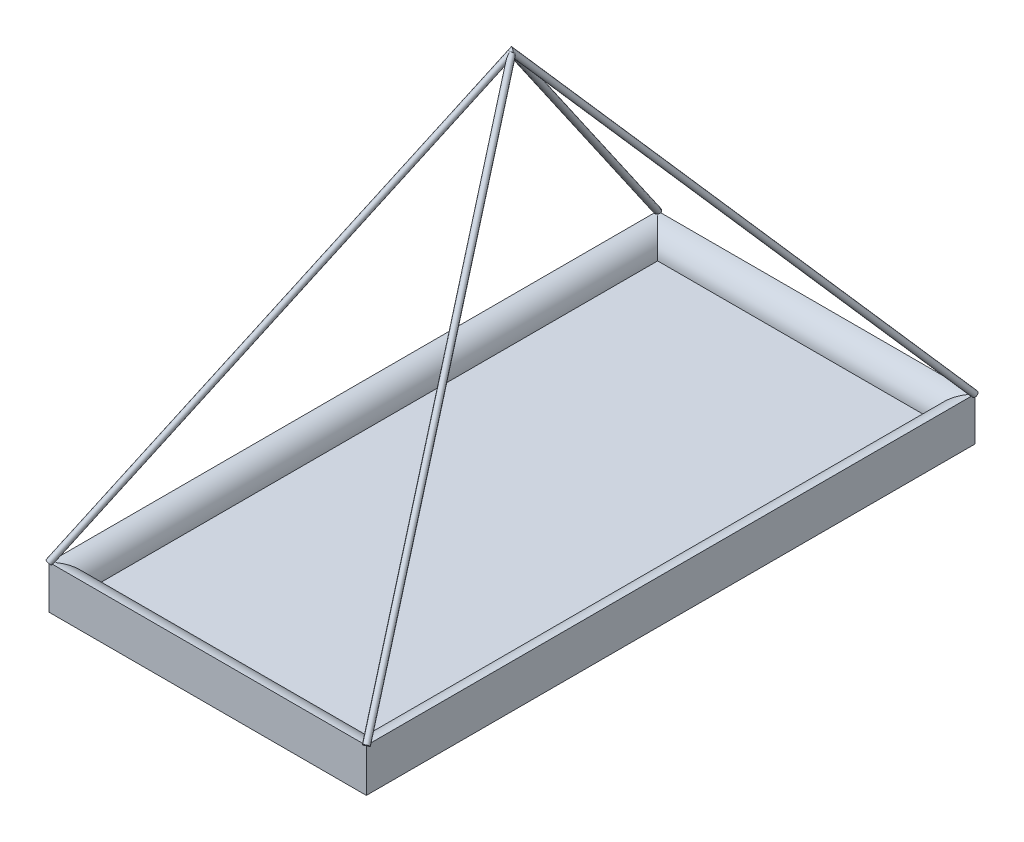
ISO-10303-21;
HEADER;
FILE_DESCRIPTION(('STEP AP214'),'2;1');
FILE_NAME('part.step','',(''),(''),'','','');
FILE_SCHEMA(('AUTOMOTIVE_DESIGN { 1 0 10303 214 1 1 1 1 }'));
ENDSEC;
DATA;
#1=APPLICATION_CONTEXT('core data for automotive mechanical design processes');
#2=APPLICATION_PROTOCOL_DEFINITION('international standard','automotive_design',2000,#1);
#3=PRODUCT_CONTEXT('',#1,'mechanical');
#4=PRODUCT('Part','Part','',(#3));
#5=PRODUCT_RELATED_PRODUCT_CATEGORY('part','',(#4));
#6=PRODUCT_DEFINITION_FORMATION('','',#4);
#7=PRODUCT_DEFINITION_CONTEXT('part definition',#1,'design');
#8=PRODUCT_DEFINITION('design','',#6,#7);
#9=PRODUCT_DEFINITION_SHAPE('','',#8);
#10=(LENGTH_UNIT() NAMED_UNIT(*) SI_UNIT(.MILLI.,.METRE.));
#11=(NAMED_UNIT(*) PLANE_ANGLE_UNIT() SI_UNIT($,.RADIAN.));
#12=(NAMED_UNIT(*) SI_UNIT($,.STERADIAN.) SOLID_ANGLE_UNIT());
#13=UNCERTAINTY_MEASURE_WITH_UNIT(LENGTH_MEASURE(1.E-05),#10,'distance_accuracy_value','');
#14=(GEOMETRIC_REPRESENTATION_CONTEXT(3) GLOBAL_UNCERTAINTY_ASSIGNED_CONTEXT((#13)) GLOBAL_UNIT_ASSIGNED_CONTEXT((#10,
#11,#12)) REPRESENTATION_CONTEXT('',''));
#15=CARTESIAN_POINT('',(0.,0.,0.));
#16=DIRECTION('',(0.,0.,1.));
#17=DIRECTION('',(1.,0.,0.));
#18=AXIS2_PLACEMENT_3D('',#15,#16,#17);
#19=CARTESIAN_POINT('',(0.,-1.11022302462516E-13,0.));
#20=DIRECTION('',(0.31472664044701,-0.732454726858496,0.603702919402901));
#21=DIRECTION('',(0.,-0.636024170320607,-0.771669135554859));
#22=AXIS2_PLACEMENT_3D('',#19,#20,#21);
#23=CYLINDRICAL_SURFACE('',#22,2.);
#24=CARTESIAN_POINT('',(110.,-256.,211.));
#25=DIRECTION('',(-0.31472664044701,0.732454726858496,-0.603702919402901));
#26=DIRECTION('',(0.,0.636024170320607,0.771669135554859));
#27=AXIS2_PLACEMENT_3D('',#24,#25,#26);
#28=CIRCLE('',#27,2.);
#29=CARTESIAN_POINT('',(110.,-254.727951659359,212.54333827111));
#30=VERTEX_POINT('',#29);
#31=EDGE_CURVE('E82',#30,#30,#28,.T.);
#32=ORIENTED_EDGE('',*,*,#31,.T.);
#33=EDGE_LOOP('',(#32));
#34=FACE_BOUND('',#33,.T.);
#35=CARTESIAN_POINT('',(0.,0.,0.));
#36=DIRECTION('',(0.,-0.771669135554859,0.636024170320607));
#37=DIRECTION('',(1.,0.,0.));
#38=AXIS2_PLACEMENT_3D('',#35,#36,#37);
#39=ELLIPSE('',#38,2.10707667589109,2.);
#40=CARTESIAN_POINT('',(0.,1.27204834064125,1.54333827110965));
#41=VERTEX_POINT('',#40);
#42=CARTESIAN_POINT('',(1.71665260553604,0.73762416644133,0.89493737729364));
#43=VERTEX_POINT('',#42);
#44=EDGE_CURVE('E13',#41,#43,#39,.F.);
#45=ORIENTED_EDGE('',*,*,#44,.F.);
#46=CARTESIAN_POINT('',(0.,0.,0.));
#47=DIRECTION('',(1.,0.,0.));
#48=DIRECTION('',(0.,-0.771669135554859,0.636024170320607));
#49=AXIS2_PLACEMENT_3D('',#46,#47,#48);
#50=ELLIPSE('',#49,6.35472102761741,2.);
#51=CARTESIAN_POINT('',(-1.5467943766283E-13,-2.9376524068879,0.));
#52=VERTEX_POINT('',#51);
#53=EDGE_CURVE('E62',#52,#41,#50,.F.);
#54=ORIENTED_EDGE('',*,*,#53,.F.);
#55=CARTESIAN_POINT('',(0.,0.,-1.23644396922088E-13));
#56=DIRECTION('',(0.,0.,1.));
#57=DIRECTION('',(0.394785423919444,-0.918773350212524,0.));
#58=AXIS2_PLACEMENT_3D('',#55,#56,#57);
#59=ELLIPSE('',#58,3.31288773951618,2.);
#60=CARTESIAN_POINT('',(1.83754670042507,0.789570847838925,-1.23644396922088E-13));
#61=VERTEX_POINT('',#60);
#62=EDGE_CURVE('E78',#61,#52,#59,.F.);
#63=ORIENTED_EDGE('',*,*,#62,.F.);
#64=CARTESIAN_POINT('',(0.,0.,-1.23644396922088E-13));
#65=DIRECTION('',(0.394785423919444,-0.918773350212524,0.));
#66=DIRECTION('',(0.,0.,1.));
#67=AXIS2_PLACEMENT_3D('',#64,#65,#66);
#68=ELLIPSE('',#67,2.50875123477774,2.);
#69=EDGE_CURVE('E75',#43,#61,#68,.F.);
#70=ORIENTED_EDGE('',*,*,#69,.F.);
#71=EDGE_LOOP('',(#45,#54,#63,#70));
#72=FACE_BOUND('',#71,.T.);
#73=ADVANCED_FACE('F52',(#34,#72),#23,.T.);
#74=CARTESIAN_POINT('',(110.,-256.,211.));
#75=DIRECTION('',(-0.31472664044701,0.732454726858496,-0.603702919402901));
#76=DIRECTION('',(0.,0.636024170320607,0.771669135554859));
#77=AXIS2_PLACEMENT_3D('',#74,#75,#76);
#78=PLANE('',#77);
#79=ORIENTED_EDGE('',*,*,#31,.F.);
#80=EDGE_LOOP('',(#79));
#81=FACE_BOUND('',#80,.T.);
#82=ADVANCED_FACE('F91',(#81),#78,.F.);
#83=CARTESIAN_POINT('',(110.,-256.,-211.));
#84=DIRECTION('',(-0.31472664044701,0.732454726858496,0.603702919402901));
#85=DIRECTION('',(0.,-0.636024170320607,0.771669135554859));
#86=AXIS2_PLACEMENT_3D('',#83,#84,#85);
#87=CYLINDRICAL_SURFACE('',#86,2.);
#88=ORIENTED_EDGE('',*,*,#69,.T.);
#89=ORIENTED_EDGE('',*,*,#62,.T.);
#90=CARTESIAN_POINT('',(0.,1.11022302462516E-13,0.));
#91=DIRECTION('',(-0.462278736410435,0.,0.886734667114561));
#92=DIRECTION('',(0.,1.,0.));
#93=AXIS2_PLACEMENT_3D('',#90,#91,#92);
#94=ELLIPSE('',#93,2.93765240688779,2.);
#95=EDGE_CURVE('E56',#52,#43,#94,.T.);
#96=ORIENTED_EDGE('',*,*,#95,.T.);
#97=EDGE_LOOP('',(#88,#89,#96));
#98=FACE_BOUND('',#97,.T.);
#99=ADVANCED_FACE('F77',(#98),#87,.F.);
#100=CARTESIAN_POINT('',(0.,-1.11022302462516E-13,1.38777878078145E-13));
#101=DIRECTION('',(-0.31472664044701,-0.732454726858496,0.603702919402901));
#102=DIRECTION('',(0.,-0.636024170320607,-0.771669135554859));
#103=AXIS2_PLACEMENT_3D('',#100,#101,#102);
#104=CYLINDRICAL_SURFACE('',#103,2.);
#105=ORIENTED_EDGE('',*,*,#53,.T.);
#106=ORIENTED_EDGE('',*,*,#44,.T.);
#107=ORIENTED_EDGE('',*,*,#95,.F.);
#108=EDGE_LOOP('',(#105,#106,#107));
#109=FACE_BOUND('',#108,.T.);
#110=ADVANCED_FACE('F54',(#109),#104,.F.);
#111=CLOSED_SHELL('',(#73,#82,#99,#110));
#112=MANIFOLD_SOLID_BREP('B2',#111);
#113=CARTESIAN_POINT('',(-110.,-256.,-211.));
#114=DIRECTION('',(0.31472664044701,0.732454726858496,0.603702919402901));
#115=DIRECTION('',(0.,-0.636024170320607,0.771669135554859));
#116=AXIS2_PLACEMENT_3D('',#113,#114,#115);
#117=CYLINDRICAL_SURFACE('',#116,2.);
#118=CARTESIAN_POINT('',(-110.,-256.,-211.));
#119=DIRECTION('',(-0.31472664044701,-0.732454726858496,-0.603702919402901));
#120=DIRECTION('',(-0.632643034783147,0.636024170320607,-0.441855231165541));
#121=AXIS2_PLACEMENT_3D('',#118,#119,#120);
#122=CIRCLE('',#121,2.);
#123=CARTESIAN_POINT('',(-111.265286069566,-254.727951659359,-211.883710462331));
#124=VERTEX_POINT('',#123);
#125=EDGE_CURVE('E191',#124,#124,#122,.T.);
#126=ORIENTED_EDGE('',*,*,#125,.F.);
#127=EDGE_LOOP('',(#126));
#128=FACE_BOUND('',#127,.T.);
#129=CARTESIAN_POINT('',(0.,0.,0.));
#130=DIRECTION('',(1.,0.,0.));
#131=DIRECTION('',(0.,0.771669135554859,0.636024170320607));
#132=AXIS2_PLACEMENT_3D('',#129,#130,#131);
#133=ELLIPSE('',#132,6.35472102761741,2.);
#134=CARTESIAN_POINT('',(0.,-2.9376524068877,0.));
#135=VERTEX_POINT('',#134);
#136=CARTESIAN_POINT('',(0.,1.27204834064124,-1.54333827110977));
#137=VERTEX_POINT('',#136);
#138=EDGE_CURVE('E182',#135,#137,#133,.T.);
#139=ORIENTED_EDGE('',*,*,#138,.F.);
#140=CARTESIAN_POINT('',(0.,0.,0.));
#141=DIRECTION('',(0.,0.,1.));
#142=DIRECTION('',(0.394785423919444,0.918773350212524,0.));
#143=AXIS2_PLACEMENT_3D('',#140,#141,#142);
#144=ELLIPSE('',#143,3.31288773951618,2.);
#145=CARTESIAN_POINT('',(-1.83754670042501,0.789570847838916,0.));
#146=VERTEX_POINT('',#145);
#147=EDGE_CURVE('E167',#146,#135,#144,.T.);
#148=ORIENTED_EDGE('',*,*,#147,.F.);
#149=CARTESIAN_POINT('',(0.,0.,0.));
#150=DIRECTION('',(0.394785423919444,0.918773350212524,0.));
#151=DIRECTION('',(0.,0.,1.));
#152=AXIS2_PLACEMENT_3D('',#149,#150,#151);
#153=ELLIPSE('',#152,2.50875123477774,2.);
#154=CARTESIAN_POINT('',(-1.71665260553602,0.737624166441306,-0.89493737729369));
#155=VERTEX_POINT('',#154);
#156=EDGE_CURVE('E50',#155,#146,#153,.T.);
#157=ORIENTED_EDGE('',*,*,#156,.F.);
#158=CARTESIAN_POINT('',(0.,0.,0.));
#159=DIRECTION('',(0.,0.771669135554859,0.636024170320607));
#160=DIRECTION('',(1.,0.,0.));
#161=AXIS2_PLACEMENT_3D('',#158,#159,#160);
#162=ELLIPSE('',#161,2.10707667589109,2.);
#163=EDGE_CURVE('E187',#137,#155,#162,.T.);
#164=ORIENTED_EDGE('',*,*,#163,.F.);
#165=EDGE_LOOP('',(#139,#148,#157,#164));
#166=FACE_BOUND('',#165,.T.);
#167=ADVANCED_FACE('F157',(#128,#166),#117,.T.);
#168=CARTESIAN_POINT('',(-110.,-256.,-211.));
#169=DIRECTION('',(-0.31472664044701,-0.732454726858496,-0.603702919402901));
#170=DIRECTION('',(-0.632643034783147,0.636024170320607,-0.441855231165541));
#171=AXIS2_PLACEMENT_3D('',#168,#169,#170);
#172=PLANE('',#171);
#173=ORIENTED_EDGE('',*,*,#125,.T.);
#174=EDGE_LOOP('',(#173));
#175=FACE_BOUND('',#174,.T.);
#176=ADVANCED_FACE('F195',(#175),#172,.T.);
#177=CARTESIAN_POINT('',(110.,-256.,-211.));
#178=DIRECTION('',(-0.31472664044701,0.732454726858496,0.603702919402901));
#179=DIRECTION('',(0.,-0.636024170320607,0.771669135554859));
#180=AXIS2_PLACEMENT_3D('',#177,#178,#179);
#181=CYLINDRICAL_SURFACE('',#180,2.);
#182=ORIENTED_EDGE('',*,*,#163,.T.);
#183=CARTESIAN_POINT('',(0.,1.11022302462516E-13,0.));
#184=DIRECTION('',(-0.462278736410435,0.,0.886734667114561));
#185=DIRECTION('',(0.,1.,0.));
#186=AXIS2_PLACEMENT_3D('',#183,#184,#185);
#187=ELLIPSE('',#186,2.93765240688779,2.);
#188=EDGE_CURVE('E161',#155,#135,#187,.T.);
#189=ORIENTED_EDGE('',*,*,#188,.T.);
#190=ORIENTED_EDGE('',*,*,#138,.T.);
#191=EDGE_LOOP('',(#182,#189,#190));
#192=FACE_BOUND('',#191,.T.);
#193=ADVANCED_FACE('F186',(#192),#181,.F.);
#194=CARTESIAN_POINT('',(0.,-1.11022302462516E-13,1.38777878078145E-13));
#195=DIRECTION('',(-0.31472664044701,-0.732454726858496,0.603702919402901));
#196=DIRECTION('',(0.,-0.636024170320607,-0.771669135554859));
#197=AXIS2_PLACEMENT_3D('',#194,#195,#196);
#198=CYLINDRICAL_SURFACE('',#197,2.);
#199=ORIENTED_EDGE('',*,*,#147,.T.);
#200=ORIENTED_EDGE('',*,*,#188,.F.);
#201=ORIENTED_EDGE('',*,*,#156,.T.);
#202=EDGE_LOOP('',(#199,#200,#201));
#203=FACE_BOUND('',#202,.T.);
#204=ADVANCED_FACE('F159',(#203),#198,.F.);
#205=CLOSED_SHELL('',(#167,#176,#193,#204));
#206=MANIFOLD_SOLID_BREP('B7',#205);
#207=CARTESIAN_POINT('',(0.,-1.11022302462516E-13,1.38777878078145E-13));
#208=DIRECTION('',(-0.31472664044701,-0.732454726858496,0.603702919402901));
#209=DIRECTION('',(0.,-0.636024170320607,-0.771669135554859));
#210=AXIS2_PLACEMENT_3D('',#207,#208,#209);
#211=CYLINDRICAL_SURFACE('',#210,2.);
#212=CARTESIAN_POINT('',(-110.,-256.,211.));
#213=DIRECTION('',(0.31472664044701,0.732454726858496,-0.603702919402901));
#214=DIRECTION('',(0.919319151413536,-0.0769391339057113,0.385917954386857));
#215=AXIS2_PLACEMENT_3D('',#212,#213,#214);
#216=CIRCLE('',#215,2.);
#217=CARTESIAN_POINT('',(-108.161361697173,-256.153878267812,211.771835908774));
#218=VERTEX_POINT('',#217);
#219=EDGE_CURVE('E269',#218,#218,#216,.T.);
#220=ORIENTED_EDGE('',*,*,#219,.T.);
#221=EDGE_LOOP('',(#220));
#222=FACE_BOUND('',#221,.T.);
#223=CARTESIAN_POINT('',(0.,0.,0.));
#224=DIRECTION('',(0.462278736410435,0.,-0.886734667114561));
#225=DIRECTION('',(0.,-1.,0.));
#226=AXIS2_PLACEMENT_3D('',#223,#224,#225);
#227=ELLIPSE('',#226,2.9376524068878,2.);
#228=CARTESIAN_POINT('',(0.,-2.93765240688775,0.));
#229=VERTEX_POINT('',#228);
#230=EDGE_CURVE('E156',#229,#229,#227,.T.);
#231=ORIENTED_EDGE('',*,*,#230,.F.);
#232=EDGE_LOOP('',(#231));
#233=FACE_BOUND('',#232,.T.);
#234=ADVANCED_FACE('F262',(#222,#233),#211,.T.);
#235=CARTESIAN_POINT('',(-110.,-256.,211.));
#236=DIRECTION('',(0.31472664044701,0.732454726858496,-0.603702919402901));
#237=DIRECTION('',(0.919319151413536,-0.0769391339057113,0.385917954386857));
#238=AXIS2_PLACEMENT_3D('',#235,#236,#237);
#239=PLANE('',#238);
#240=ORIENTED_EDGE('',*,*,#219,.F.);
#241=EDGE_LOOP('',(#240));
#242=FACE_BOUND('',#241,.T.);
#243=ADVANCED_FACE('F277',(#242),#239,.F.);
#244=CARTESIAN_POINT('',(0.,0.,0.));
#245=DIRECTION('',(0.462278736410435,0.,-0.886734667114561));
#246=DIRECTION('',(-0.886734667114561,0.,-0.462278736410435));
#247=AXIS2_PLACEMENT_3D('',#244,#245,#246);
#248=PLANE('',#247);
#249=ORIENTED_EDGE('',*,*,#230,.T.);
#250=EDGE_LOOP('',(#249));
#251=FACE_BOUND('',#250,.T.);
#252=ADVANCED_FACE('F264',(#251),#248,.T.);
#253=CLOSED_SHELL('',(#234,#243,#252));
#254=MANIFOLD_SOLID_BREP('B44',#253);
#255=CARTESIAN_POINT('',(110.,-256.,-211.));
#256=DIRECTION('',(-0.31472664044701,0.732454726858496,0.603702919402901));
#257=DIRECTION('',(0.,-0.636024170320607,0.771669135554859));
#258=AXIS2_PLACEMENT_3D('',#255,#256,#257);
#259=CYLINDRICAL_SURFACE('',#258,2.);
#260=CARTESIAN_POINT('',(110.,-256.,-211.));
#261=DIRECTION('',(0.31472664044701,-0.732454726858496,-0.603702919402901));
#262=DIRECTION('',(0.842789029699513,-0.0769391339057113,0.532716642401936));
#263=AXIS2_PLACEMENT_3D('',#260,#261,#262);
#264=CIRCLE('',#263,2.);
#265=CARTESIAN_POINT('',(111.685578059399,-256.153878267811,-209.934566715196));
#266=VERTEX_POINT('',#265);
#267=EDGE_CURVE('E339',#266,#266,#264,.T.);
#268=ORIENTED_EDGE('',*,*,#267,.F.);
#269=EDGE_LOOP('',(#268));
#270=FACE_BOUND('',#269,.T.);
#271=CARTESIAN_POINT('',(0.,1.11022302462516E-13,0.));
#272=DIRECTION('',(-0.462278736410435,0.,0.886734667114561));
#273=DIRECTION('',(0.,1.,0.));
#274=AXIS2_PLACEMENT_3D('',#271,#272,#273);
#275=ELLIPSE('',#274,2.93765240688779,2.);
#276=CARTESIAN_POINT('',(0.,2.93765240688791,0.));
#277=VERTEX_POINT('',#276);
#278=EDGE_CURVE('E261',#277,#277,#275,.T.);
#279=ORIENTED_EDGE('',*,*,#278,.F.);
#280=EDGE_LOOP('',(#279));
#281=FACE_BOUND('',#280,.T.);
#282=ADVANCED_FACE('F332',(#270,#281),#259,.T.);
#283=CARTESIAN_POINT('',(110.,-256.,-211.));
#284=DIRECTION('',(0.31472664044701,-0.732454726858496,-0.603702919402901));
#285=DIRECTION('',(0.842789029699513,-0.0769391339057113,0.532716642401936));
#286=AXIS2_PLACEMENT_3D('',#283,#284,#285);
#287=PLANE('',#286);
#288=ORIENTED_EDGE('',*,*,#267,.T.);
#289=EDGE_LOOP('',(#288));
#290=FACE_BOUND('',#289,.T.);
#291=ADVANCED_FACE('F345',(#290),#287,.T.);
#292=CARTESIAN_POINT('',(0.,0.,0.));
#293=DIRECTION('',(-0.462278736410435,0.,0.886734667114561));
#294=DIRECTION('',(0.886734667114561,0.,0.462278736410435));
#295=AXIS2_PLACEMENT_3D('',#292,#293,#294);
#296=PLANE('',#295);
#297=ORIENTED_EDGE('',*,*,#278,.T.);
#298=EDGE_LOOP('',(#297));
#299=FACE_BOUND('',#298,.T.);
#300=ADVANCED_FACE('F334',(#299),#296,.T.);
#301=CLOSED_SHELL('',(#282,#291,#300));
#302=MANIFOLD_SOLID_BREP('B151',#301);
#303=CARTESIAN_POINT('',(-110.,-256.,211.));
#304=DIRECTION('',(1.,0.,0.));
#305=DIRECTION('',(0.,0.,-1.));
#306=AXIS2_PLACEMENT_3D('',#303,#304,#305);
#307=PLANE('',#306);
#308=DIRECTION('',(0.,-1.,0.));
#309=VECTOR('',#308,1.);
#310=CARTESIAN_POINT('',(-110.,-256.,-211.));
#311=LINE('',#310,#309);
#312=CARTESIAN_POINT('',(-110.,-256.,-211.));
#313=VERTEX_POINT('',#312);
#314=CARTESIAN_POINT('',(-110.,-286.,-211.));
#315=VERTEX_POINT('',#314);
#316=EDGE_CURVE('E498',#313,#315,#311,.T.);
#317=ORIENTED_EDGE('',*,*,#316,.T.);
#318=DIRECTION('',(0.,0.,-1.));
#319=VECTOR('',#318,1.);
#320=CARTESIAN_POINT('',(-110.,-286.,211.));
#321=LINE('',#320,#319);
#322=CARTESIAN_POINT('',(-110.,-286.,211.));
#323=VERTEX_POINT('',#322);
#324=EDGE_CURVE('E330',#323,#315,#321,.T.);
#325=ORIENTED_EDGE('',*,*,#324,.F.);
#326=DIRECTION('',(0.,-1.,0.));
#327=VECTOR('',#326,1.);
#328=CARTESIAN_POINT('',(-110.,-256.,211.));
#329=LINE('',#328,#327);
#330=CARTESIAN_POINT('',(-110.,-256.,211.));
#331=VERTEX_POINT('',#330);
#332=EDGE_CURVE('E494',#331,#323,#329,.T.);
#333=ORIENTED_EDGE('',*,*,#332,.F.);
#334=DIRECTION('',(0.,0.,-1.));
#335=VECTOR('',#334,1.);
#336=CARTESIAN_POINT('',(-110.,-256.,211.));
#337=LINE('',#336,#335);
#338=EDGE_CURVE('E439',#331,#313,#337,.T.);
#339=ORIENTED_EDGE('',*,*,#338,.T.);
#340=EDGE_LOOP('',(#317,#325,#333,#339));
#341=FACE_BOUND('',#340,.T.);
#342=ADVANCED_FACE('F394',(#341),#307,.F.);
#343=CARTESIAN_POINT('',(-110.,-286.,211.));
#344=DIRECTION('',(0.,1.,0.));
#345=DIRECTION('',(0.,0.,1.));
#346=AXIS2_PLACEMENT_3D('',#343,#344,#345);
#347=PLANE('',#346);
#348=DIRECTION('',(1.,0.,0.));
#349=VECTOR('',#348,1.);
#350=CARTESIAN_POINT('',(-110.,-286.,-211.));
#351=LINE('',#350,#349);
#352=CARTESIAN_POINT('',(110.,-286.,-211.));
#353=VERTEX_POINT('',#352);
#354=EDGE_CURVE('E496',#315,#353,#351,.T.);
#355=ORIENTED_EDGE('',*,*,#354,.T.);
#356=DIRECTION('',(0.,0.,-1.));
#357=VECTOR('',#356,1.);
#358=CARTESIAN_POINT('',(110.,-286.,211.));
#359=LINE('',#358,#357);
#360=CARTESIAN_POINT('',(110.,-286.,211.));
#361=VERTEX_POINT('',#360);
#362=EDGE_CURVE('E404',#361,#353,#359,.T.);
#363=ORIENTED_EDGE('',*,*,#362,.F.);
#364=DIRECTION('',(1.,0.,0.));
#365=VECTOR('',#364,1.);
#366=CARTESIAN_POINT('',(-110.,-286.,211.));
#367=LINE('',#366,#365);
#368=EDGE_CURVE('E446',#323,#361,#367,.T.);
#369=ORIENTED_EDGE('',*,*,#368,.F.);
#370=ORIENTED_EDGE('',*,*,#324,.T.);
#371=EDGE_LOOP('',(#355,#363,#369,#370));
#372=FACE_BOUND('',#371,.T.);
#373=ADVANCED_FACE('F513',(#372),#347,.F.);
#374=CARTESIAN_POINT('',(110.,-256.,211.));
#375=DIRECTION('',(-1.,0.,0.));
#376=DIRECTION('',(0.,-1.,0.));
#377=AXIS2_PLACEMENT_3D('',#374,#375,#376);
#378=PLANE('',#377);
#379=DIRECTION('',(0.,1.,0.));
#380=VECTOR('',#379,1.);
#381=CARTESIAN_POINT('',(110.,-256.,-211.));
#382=LINE('',#381,#380);
#383=CARTESIAN_POINT('',(110.,-256.,-211.));
#384=VERTEX_POINT('',#383);
#385=EDGE_CURVE('E432',#353,#384,#382,.T.);
#386=ORIENTED_EDGE('',*,*,#385,.T.);
#387=DIRECTION('',(0.,0.,-1.));
#388=VECTOR('',#387,1.);
#389=CARTESIAN_POINT('',(110.,-256.,211.));
#390=LINE('',#389,#388);
#391=CARTESIAN_POINT('',(110.,-256.,211.));
#392=VERTEX_POINT('',#391);
#393=EDGE_CURVE('E482',#392,#384,#390,.T.);
#394=ORIENTED_EDGE('',*,*,#393,.F.);
#395=DIRECTION('',(0.,1.,0.));
#396=VECTOR('',#395,1.);
#397=CARTESIAN_POINT('',(110.,-256.,211.));
#398=LINE('',#397,#396);
#399=EDGE_CURVE('E502',#361,#392,#398,.T.);
#400=ORIENTED_EDGE('',*,*,#399,.F.);
#401=ORIENTED_EDGE('',*,*,#362,.T.);
#402=EDGE_LOOP('',(#386,#394,#400,#401));
#403=FACE_BOUND('',#402,.T.);
#404=ADVANCED_FACE('F515',(#403),#378,.F.);
#405=CARTESIAN_POINT('',(0.,0.,211.));
#406=DIRECTION('',(0.,0.,1.));
#407=DIRECTION('',(1.,0.,0.));
#408=AXIS2_PLACEMENT_3D('',#405,#406,#407);
#409=PLANE('',#408);
#410=ORIENTED_EDGE('',*,*,#332,.T.);
#411=ORIENTED_EDGE('',*,*,#368,.T.);
#412=ORIENTED_EDGE('',*,*,#399,.T.);
#413=DIRECTION('',(-1.,0.,0.));
#414=VECTOR('',#413,1.);
#415=CARTESIAN_POINT('',(-110.,-256.,211.));
#416=LINE('',#415,#414);
#417=EDGE_CURVE('E491',#392,#331,#416,.T.);
#418=ORIENTED_EDGE('',*,*,#417,.T.);
#419=EDGE_LOOP('',(#410,#411,#412,#418));
#420=FACE_BOUND('',#419,.T.);
#421=ADVANCED_FACE('F510',(#420),#409,.T.);
#422=CARTESIAN_POINT('',(0.,0.,-211.));
#423=DIRECTION('',(0.,0.,1.));
#424=DIRECTION('',(1.,0.,0.));
#425=AXIS2_PLACEMENT_3D('',#422,#423,#424);
#426=PLANE('',#425);
#427=ORIENTED_EDGE('',*,*,#316,.F.);
#428=DIRECTION('',(-1.,0.,0.));
#429=VECTOR('',#428,1.);
#430=CARTESIAN_POINT('',(-110.,-256.,-211.));
#431=LINE('',#430,#429);
#432=EDGE_CURVE('E492',#384,#313,#431,.T.);
#433=ORIENTED_EDGE('',*,*,#432,.F.);
#434=ORIENTED_EDGE('',*,*,#385,.F.);
#435=ORIENTED_EDGE('',*,*,#354,.F.);
#436=EDGE_LOOP('',(#427,#433,#434,#435));
#437=FACE_BOUND('',#436,.T.);
#438=ADVANCED_FACE('F516',(#437),#426,.F.);
#439=CARTESIAN_POINT('',(-110.,-271.,211.));
#440=DIRECTION('',(0.,1.,0.));
#441=DIRECTION('',(0.,0.,1.));
#442=AXIS2_PLACEMENT_3D('',#439,#440,#441);
#443=PLANE('',#442);
#444=DIRECTION('',(1.,0.,0.));
#445=VECTOR('',#444,1.);
#446=CARTESIAN_POINT('',(-110.,-271.,-196.));
#447=LINE('',#446,#445);
#448=CARTESIAN_POINT('',(-95.,-271.,-196.));
#449=VERTEX_POINT('',#448);
#450=CARTESIAN_POINT('',(95.,-271.,-196.));
#451=VERTEX_POINT('',#450);
#452=EDGE_CURVE('E465',#449,#451,#447,.T.);
#453=ORIENTED_EDGE('',*,*,#452,.F.);
#454=DIRECTION('',(0.,0.,-1.));
#455=VECTOR('',#454,1.);
#456=CARTESIAN_POINT('',(-95.,-271.,211.));
#457=LINE('',#456,#455);
#458=CARTESIAN_POINT('',(-95.,-271.,196.));
#459=VERTEX_POINT('',#458);
#460=EDGE_CURVE('E471',#459,#449,#457,.T.);
#461=ORIENTED_EDGE('',*,*,#460,.F.);
#462=DIRECTION('',(1.,0.,0.));
#463=VECTOR('',#462,1.);
#464=CARTESIAN_POINT('',(-110.,-271.,196.));
#465=LINE('',#464,#463);
#466=CARTESIAN_POINT('',(95.,-271.,196.));
#467=VERTEX_POINT('',#466);
#468=EDGE_CURVE('E467',#459,#467,#465,.T.);
#469=ORIENTED_EDGE('',*,*,#468,.T.);
#470=DIRECTION('',(0.,0.,-1.));
#471=VECTOR('',#470,1.);
#472=CARTESIAN_POINT('',(95.,-271.,211.));
#473=LINE('',#472,#471);
#474=EDGE_CURVE('E462',#467,#451,#473,.T.);
#475=ORIENTED_EDGE('',*,*,#474,.T.);
#476=EDGE_LOOP('',(#453,#461,#469,#475));
#477=FACE_BOUND('',#476,.T.);
#478=ADVANCED_FACE('F464',(#477),#443,.T.);
#479=CARTESIAN_POINT('',(0.,-271.,-211.));
#480=DIRECTION('',(1.,0.,0.));
#481=DIRECTION('',(0.,0.,-1.));
#482=AXIS2_PLACEMENT_3D('',#479,#480,#481);
#483=CYLINDRICAL_SURFACE('',#482,15.);
#484=CARTESIAN_POINT('',(-110.,-271.,-211.));
#485=DIRECTION('',(0.707106781186547,0.,-0.707106781186547));
#486=DIRECTION('',(0.707106781186547,0.,0.707106781186547));
#487=AXIS2_PLACEMENT_3D('',#484,#485,#486);
#488=ELLIPSE('',#487,21.2132034355964,15.);
#489=EDGE_CURVE('E478',#449,#313,#488,.F.);
#490=ORIENTED_EDGE('',*,*,#489,.F.);
#491=ORIENTED_EDGE('',*,*,#452,.T.);
#492=CARTESIAN_POINT('',(110.,-271.,-211.));
#493=DIRECTION('',(0.707106781186547,0.,0.707106781186547));
#494=DIRECTION('',(-0.707106781186547,0.,0.707106781186547));
#495=AXIS2_PLACEMENT_3D('',#492,#493,#494);
#496=ELLIPSE('',#495,21.2132034355964,15.);
#497=EDGE_CURVE('E398',#384,#451,#496,.T.);
#498=ORIENTED_EDGE('',*,*,#497,.F.);
#499=ORIENTED_EDGE('',*,*,#432,.T.);
#500=EDGE_LOOP('',(#490,#491,#498,#499));
#501=FACE_BOUND('',#500,.T.);
#502=ADVANCED_FACE('F396',(#501),#483,.T.);
#503=CARTESIAN_POINT('',(110.,-271.,211.));
#504=DIRECTION('',(0.,0.,1.));
#505=DIRECTION('',(1.,0.,0.));
#506=AXIS2_PLACEMENT_3D('',#503,#504,#505);
#507=CYLINDRICAL_SURFACE('',#506,15.);
#508=ORIENTED_EDGE('',*,*,#497,.T.);
#509=ORIENTED_EDGE('',*,*,#474,.F.);
#510=CARTESIAN_POINT('',(110.,-271.,211.));
#511=DIRECTION('',(-0.707106781186547,0.,0.707106781186547));
#512=DIRECTION('',(-0.707106781186547,0.,-0.707106781186547));
#513=AXIS2_PLACEMENT_3D('',#510,#511,#512);
#514=ELLIPSE('',#513,21.2132034355964,15.);
#515=EDGE_CURVE('E483',#392,#467,#514,.T.);
#516=ORIENTED_EDGE('',*,*,#515,.F.);
#517=ORIENTED_EDGE('',*,*,#393,.T.);
#518=EDGE_LOOP('',(#508,#509,#516,#517));
#519=FACE_BOUND('',#518,.T.);
#520=ADVANCED_FACE('F481',(#519),#507,.T.);
#521=CARTESIAN_POINT('',(-110.,-271.,211.));
#522=DIRECTION('',(0.,0.,1.));
#523=DIRECTION('',(1.,0.,0.));
#524=AXIS2_PLACEMENT_3D('',#521,#522,#523);
#525=CYLINDRICAL_SURFACE('',#524,15.);
#526=ORIENTED_EDGE('',*,*,#489,.T.);
#527=ORIENTED_EDGE('',*,*,#338,.F.);
#528=CARTESIAN_POINT('',(-110.,-271.,211.));
#529=DIRECTION('',(-0.707106781186547,0.,-0.707106781186547));
#530=DIRECTION('',(-0.707106781186547,0.,0.707106781186547));
#531=AXIS2_PLACEMENT_3D('',#528,#529,#530);
#532=ELLIPSE('',#531,21.2132034355964,15.);
#533=EDGE_CURVE('E413',#459,#331,#532,.F.);
#534=ORIENTED_EDGE('',*,*,#533,.F.);
#535=ORIENTED_EDGE('',*,*,#460,.T.);
#536=EDGE_LOOP('',(#526,#527,#534,#535));
#537=FACE_BOUND('',#536,.T.);
#538=ADVANCED_FACE('F507',(#537),#525,.T.);
#539=CARTESIAN_POINT('',(-110.,-271.,211.));
#540=DIRECTION('',(-1.,0.,0.));
#541=DIRECTION('',(0.,0.,1.));
#542=AXIS2_PLACEMENT_3D('',#539,#540,#541);
#543=CYLINDRICAL_SURFACE('',#542,15.);
#544=ORIENTED_EDGE('',*,*,#515,.T.);
#545=ORIENTED_EDGE('',*,*,#468,.F.);
#546=ORIENTED_EDGE('',*,*,#533,.T.);
#547=ORIENTED_EDGE('',*,*,#417,.F.);
#548=EDGE_LOOP('',(#544,#545,#546,#547));
#549=FACE_BOUND('',#548,.T.);
#550=ADVANCED_FACE('F508',(#549),#543,.T.);
#551=CLOSED_SHELL('',(#342,#373,#404,#421,#438,#478,#502,#520,#538,#550));
#552=MANIFOLD_SOLID_BREP('B256',#551);
#553=ADVANCED_BREP_SHAPE_REPRESENTATION('',(#18,#112,#206,#254,#302,#552),#14);
#554=SHAPE_DEFINITION_REPRESENTATION(#9,#553);
ENDSEC;
END-ISO-10303-21;
